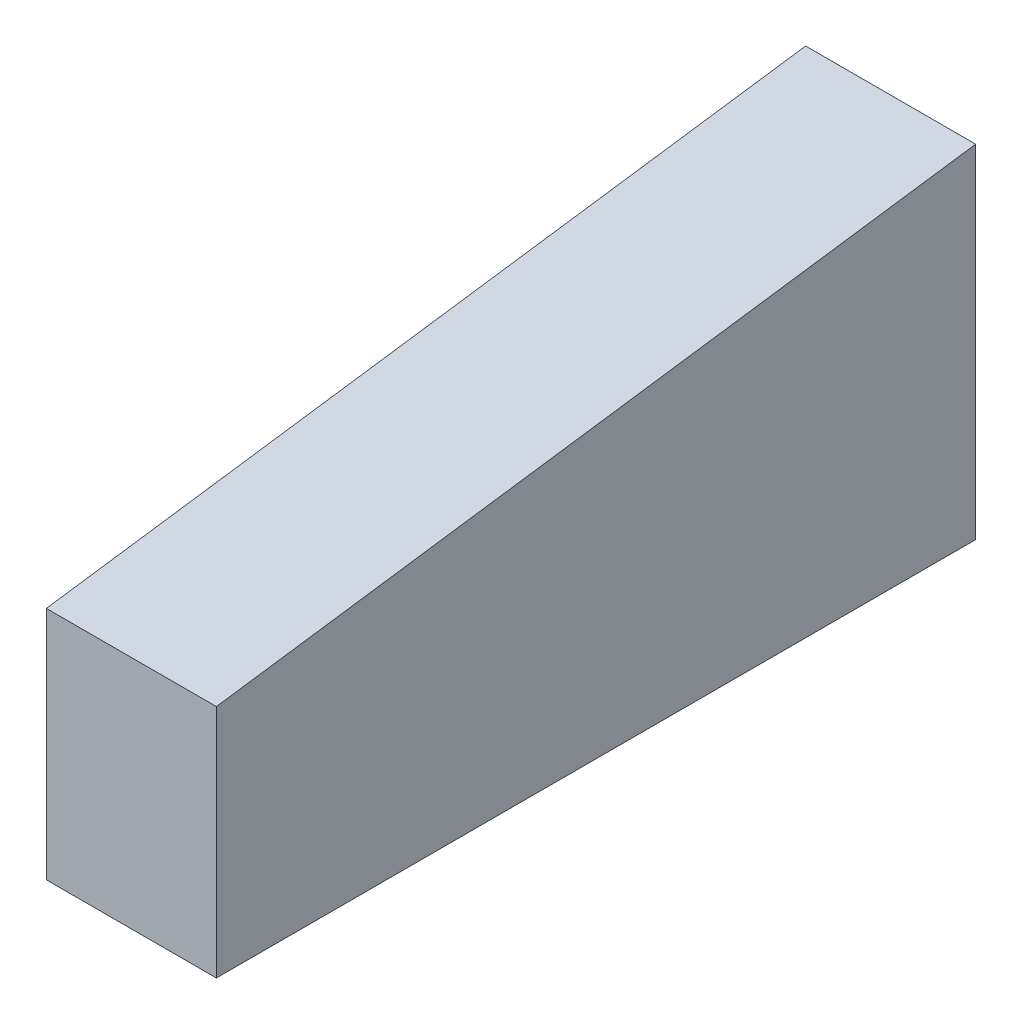
ISO-10303-21;
HEADER;
FILE_DESCRIPTION(('STEP AP214'),'2;1');
FILE_NAME('part.step','',(''),(''),'','','');
FILE_SCHEMA(('AUTOMOTIVE_DESIGN { 1 0 10303 214 1 1 1 1 }'));
ENDSEC;
DATA;
#1=APPLICATION_CONTEXT('core data for automotive mechanical design processes');
#2=APPLICATION_PROTOCOL_DEFINITION('international standard','automotive_design',2000,#1);
#3=PRODUCT_CONTEXT('',#1,'mechanical');
#4=PRODUCT('Part','Part','',(#3));
#5=PRODUCT_RELATED_PRODUCT_CATEGORY('part','',(#4));
#6=PRODUCT_DEFINITION_FORMATION('','',#4);
#7=PRODUCT_DEFINITION_CONTEXT('part definition',#1,'design');
#8=PRODUCT_DEFINITION('design','',#6,#7);
#9=PRODUCT_DEFINITION_SHAPE('','',#8);
#10=(LENGTH_UNIT() NAMED_UNIT(*) SI_UNIT(.MILLI.,.METRE.));
#11=(NAMED_UNIT(*) PLANE_ANGLE_UNIT() SI_UNIT($,.RADIAN.));
#12=(NAMED_UNIT(*) SI_UNIT($,.STERADIAN.) SOLID_ANGLE_UNIT());
#13=UNCERTAINTY_MEASURE_WITH_UNIT(LENGTH_MEASURE(1.E-05),#10,'distance_accuracy_value','');
#14=(GEOMETRIC_REPRESENTATION_CONTEXT(3) GLOBAL_UNCERTAINTY_ASSIGNED_CONTEXT((#13)) GLOBAL_UNIT_ASSIGNED_CONTEXT((#10,
#11,#12)) REPRESENTATION_CONTEXT('',''));
#15=CARTESIAN_POINT('',(0.,0.,0.));
#16=DIRECTION('',(0.,0.,1.));
#17=DIRECTION('',(1.,0.,0.));
#18=AXIS2_PLACEMENT_3D('',#15,#16,#17);
#19=CARTESIAN_POINT('',(24.8247080850774,100.,110.848566398658));
#20=DIRECTION('',(-1.,0.,0.));
#21=DIRECTION('',(0.,0.,1.));
#22=AXIS2_PLACEMENT_3D('',#19,#20,#21);
#23=PLANE('',#22);
#24=DIRECTION('',(0.,-1.,0.));
#25=VECTOR('',#24,1.);
#26=CARTESIAN_POINT('',(24.8247080850774,100.,-110.848566398658));
#27=LINE('',#26,#25);
#28=CARTESIAN_POINT('',(24.8247080850774,100.,-110.848566398658));
#29=VERTEX_POINT('',#28);
#30=CARTESIAN_POINT('',(24.8247080850774,0.,-110.848566398658));
#31=VERTEX_POINT('',#30);
#32=EDGE_CURVE('E11',#29,#31,#27,.T.);
#33=ORIENTED_EDGE('',*,*,#32,.F.);
#34=DIRECTION('',(0.,0.140087853112211,-0.990139077812007));
#35=VECTOR('',#34,1.);
#36=CARTESIAN_POINT('',(24.8247080850774,100.,-110.848566398658));
#37=LINE('',#36,#35);
#38=CARTESIAN_POINT('',(24.8247080850774,68.6336232245894,110.848566398658));
#39=VERTEX_POINT('',#38);
#40=EDGE_CURVE('E48',#39,#29,#37,.T.);
#41=ORIENTED_EDGE('',*,*,#40,.F.);
#42=DIRECTION('',(0.,-1.,0.));
#43=VECTOR('',#42,1.);
#44=CARTESIAN_POINT('',(24.8247080850774,100.,110.848566398658));
#45=LINE('',#44,#43);
#46=CARTESIAN_POINT('',(24.8247080850774,0.,110.848566398658));
#47=VERTEX_POINT('',#46);
#48=EDGE_CURVE('E77',#39,#47,#45,.T.);
#49=ORIENTED_EDGE('',*,*,#48,.T.);
#50=DIRECTION('',(0.,0.,-1.));
#51=VECTOR('',#50,1.);
#52=CARTESIAN_POINT('',(24.8247080850774,0.,110.848566398658));
#53=LINE('',#52,#51);
#54=EDGE_CURVE('E89',#47,#31,#53,.T.);
#55=ORIENTED_EDGE('',*,*,#54,.T.);
#56=EDGE_LOOP('',(#33,#41,#49,#55));
#57=FACE_BOUND('',#56,.T.);
#58=ADVANCED_FACE('F33',(#57),#23,.F.);
#59=CARTESIAN_POINT('',(-24.8247080850774,100.,-110.848566398658));
#60=DIRECTION('',(0.,0.,1.));
#61=DIRECTION('',(1.,0.,0.));
#62=AXIS2_PLACEMENT_3D('',#59,#60,#61);
#63=PLANE('',#62);
#64=DIRECTION('',(-1.,0.,0.));
#65=VECTOR('',#64,1.);
#66=CARTESIAN_POINT('',(-24.8247080850774,0.,-110.848566398658));
#67=LINE('',#66,#65);
#68=CARTESIAN_POINT('',(-24.8247080850774,0.,-110.848566398658));
#69=VERTEX_POINT('',#68);
#70=EDGE_CURVE('E85',#31,#69,#67,.T.);
#71=ORIENTED_EDGE('',*,*,#70,.T.);
#72=DIRECTION('',(0.,-1.,0.));
#73=VECTOR('',#72,1.);
#74=CARTESIAN_POINT('',(-24.8247080850774,100.,-110.848566398658));
#75=LINE('',#74,#73);
#76=CARTESIAN_POINT('',(-24.8247080850774,100.,-110.848566398658));
#77=VERTEX_POINT('',#76);
#78=EDGE_CURVE('E41',#77,#69,#75,.T.);
#79=ORIENTED_EDGE('',*,*,#78,.F.);
#80=DIRECTION('',(-1.,0.,0.));
#81=VECTOR('',#80,1.);
#82=CARTESIAN_POINT('',(-24.8247080850774,100.,-110.848566398658));
#83=LINE('',#82,#81);
#84=EDGE_CURVE('E90',#29,#77,#83,.T.);
#85=ORIENTED_EDGE('',*,*,#84,.F.);
#86=ORIENTED_EDGE('',*,*,#32,.T.);
#87=EDGE_LOOP('',(#71,#79,#85,#86));
#88=FACE_BOUND('',#87,.T.);
#89=ADVANCED_FACE('F104',(#88),#63,.F.);
#90=CARTESIAN_POINT('',(-24.8247080850774,100.,110.848566398658));
#91=DIRECTION('',(1.,0.,0.));
#92=DIRECTION('',(0.,0.,-1.));
#93=AXIS2_PLACEMENT_3D('',#90,#91,#92);
#94=PLANE('',#93);
#95=DIRECTION('',(0.,-1.,0.));
#96=VECTOR('',#95,1.);
#97=CARTESIAN_POINT('',(-24.8247080850774,100.,110.848566398658));
#98=LINE('',#97,#96);
#99=CARTESIAN_POINT('',(-24.8247080850774,68.6336232245894,110.848566398658));
#100=VERTEX_POINT('',#99);
#101=CARTESIAN_POINT('',(-24.8247080850774,0.,110.848566398658));
#102=VERTEX_POINT('',#101);
#103=EDGE_CURVE('E66',#100,#102,#98,.T.);
#104=ORIENTED_EDGE('',*,*,#103,.F.);
#105=DIRECTION('',(0.,0.140087853112211,-0.990139077812007));
#106=VECTOR('',#105,1.);
#107=CARTESIAN_POINT('',(-24.8247080850774,69.2491760289477,106.497847385471));
#108=LINE('',#107,#106);
#109=EDGE_CURVE('E100',#100,#77,#108,.T.);
#110=ORIENTED_EDGE('',*,*,#109,.T.);
#111=ORIENTED_EDGE('',*,*,#78,.T.);
#112=DIRECTION('',(0.,0.,1.));
#113=VECTOR('',#112,1.);
#114=CARTESIAN_POINT('',(-24.8247080850774,0.,110.848566398658));
#115=LINE('',#114,#113);
#116=EDGE_CURVE('E81',#69,#102,#115,.T.);
#117=ORIENTED_EDGE('',*,*,#116,.T.);
#118=EDGE_LOOP('',(#104,#110,#111,#117));
#119=FACE_BOUND('',#118,.T.);
#120=ADVANCED_FACE('F82',(#119),#94,.F.);
#121=CARTESIAN_POINT('',(-24.8247080850774,100.,110.848566398658));
#122=DIRECTION('',(0.,0.,-1.));
#123=DIRECTION('',(-1.,0.,0.));
#124=AXIS2_PLACEMENT_3D('',#121,#122,#123);
#125=PLANE('',#124);
#126=ORIENTED_EDGE('',*,*,#48,.F.);
#127=DIRECTION('',(1.,0.,0.));
#128=VECTOR('',#127,1.);
#129=CARTESIAN_POINT('',(-75.1752919149226,68.6336232245894,110.848566398658));
#130=LINE('',#129,#128);
#131=EDGE_CURVE('E74',#100,#39,#130,.T.);
#132=ORIENTED_EDGE('',*,*,#131,.F.);
#133=ORIENTED_EDGE('',*,*,#103,.T.);
#134=DIRECTION('',(1.,0.,0.));
#135=VECTOR('',#134,1.);
#136=CARTESIAN_POINT('',(-24.8247080850774,0.,110.848566398658));
#137=LINE('',#136,#135);
#138=EDGE_CURVE('E71',#102,#47,#137,.T.);
#139=ORIENTED_EDGE('',*,*,#138,.T.);
#140=EDGE_LOOP('',(#126,#132,#133,#139));
#141=FACE_BOUND('',#140,.T.);
#142=ADVANCED_FACE('F69',(#141),#125,.F.);
#143=CARTESIAN_POINT('',(0.,0.,0.));
#144=DIRECTION('',(0.,-1.,0.));
#145=DIRECTION('',(0.,0.,-1.));
#146=AXIS2_PLACEMENT_3D('',#143,#144,#145);
#147=PLANE('',#146);
#148=ORIENTED_EDGE('',*,*,#54,.F.);
#149=ORIENTED_EDGE('',*,*,#138,.F.);
#150=ORIENTED_EDGE('',*,*,#116,.F.);
#151=ORIENTED_EDGE('',*,*,#70,.F.);
#152=EDGE_LOOP('',(#148,#149,#150,#151));
#153=FACE_BOUND('',#152,.T.);
#154=ADVANCED_FACE('F87',(#153),#147,.T.);
#155=CARTESIAN_POINT('',(-75.1752919149226,100.,-110.848566398658));
#156=DIRECTION('',(0.,-0.990139077812007,-0.140087853112211));
#157=DIRECTION('',(0.,0.140087853112211,-0.990139077812007));
#158=AXIS2_PLACEMENT_3D('',#155,#156,#157);
#159=PLANE('',#158);
#160=ORIENTED_EDGE('',*,*,#131,.T.);
#161=ORIENTED_EDGE('',*,*,#40,.T.);
#162=ORIENTED_EDGE('',*,*,#84,.T.);
#163=ORIENTED_EDGE('',*,*,#109,.F.);
#164=EDGE_LOOP('',(#160,#161,#162,#163));
#165=FACE_BOUND('',#164,.T.);
#166=ADVANCED_FACE('F101',(#165),#159,.F.);
#167=CLOSED_SHELL('',(#58,#89,#120,#142,#154,#166));
#168=MANIFOLD_SOLID_BREP('B2',#167);
#169=ADVANCED_BREP_SHAPE_REPRESENTATION('',(#18,#168),#14);
#170=SHAPE_DEFINITION_REPRESENTATION(#9,#169);
ENDSEC;
END-ISO-10303-21;
